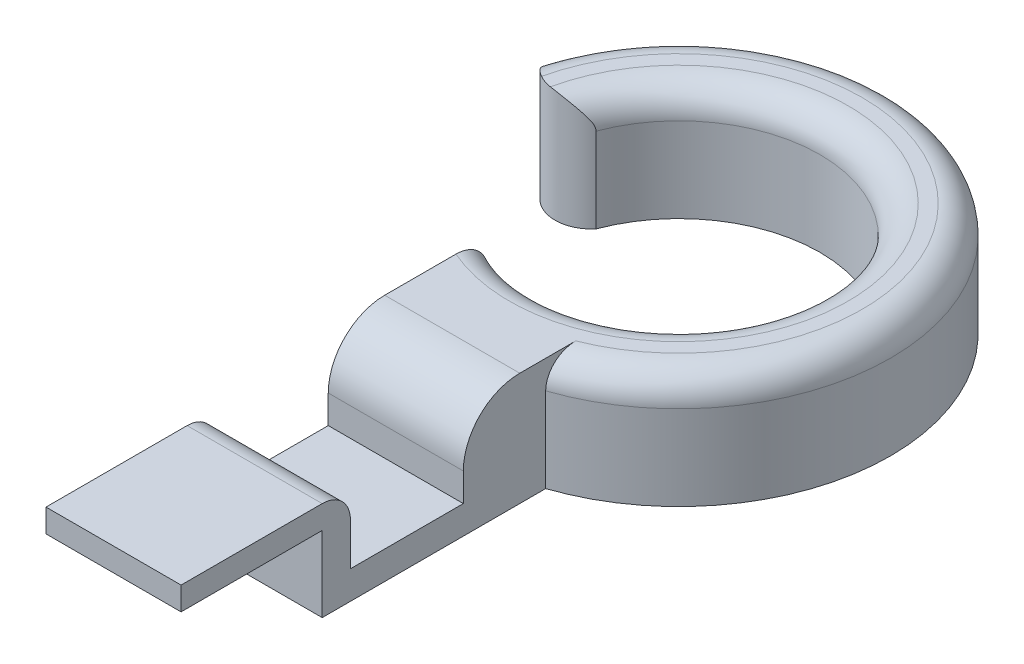
ISO-10303-21;
HEADER;
FILE_DESCRIPTION(('STEP AP214'),'2;1');
FILE_NAME('part.step','',(''),(''),'','','');
FILE_SCHEMA(('AUTOMOTIVE_DESIGN { 1 0 10303 214 1 1 1 1 }'));
ENDSEC;
DATA;
#1=APPLICATION_CONTEXT('core data for automotive mechanical design processes');
#2=APPLICATION_PROTOCOL_DEFINITION('international standard','automotive_design',2000,#1);
#3=PRODUCT_CONTEXT('',#1,'mechanical');
#4=PRODUCT('Part','Part','',(#3));
#5=PRODUCT_RELATED_PRODUCT_CATEGORY('part','',(#4));
#6=PRODUCT_DEFINITION_FORMATION('','',#4);
#7=PRODUCT_DEFINITION_CONTEXT('part definition',#1,'design');
#8=PRODUCT_DEFINITION('design','',#6,#7);
#9=PRODUCT_DEFINITION_SHAPE('','',#8);
#10=(LENGTH_UNIT() NAMED_UNIT(*) SI_UNIT(.MILLI.,.METRE.));
#11=(NAMED_UNIT(*) PLANE_ANGLE_UNIT() SI_UNIT($,.RADIAN.));
#12=(NAMED_UNIT(*) SI_UNIT($,.STERADIAN.) SOLID_ANGLE_UNIT());
#13=UNCERTAINTY_MEASURE_WITH_UNIT(LENGTH_MEASURE(1.E-05),#10,'distance_accuracy_value','');
#14=(GEOMETRIC_REPRESENTATION_CONTEXT(3) GLOBAL_UNCERTAINTY_ASSIGNED_CONTEXT((#13)) GLOBAL_UNIT_ASSIGNED_CONTEXT((#10,
#11,#12)) REPRESENTATION_CONTEXT('',''));
#15=CARTESIAN_POINT('',(0.,0.,0.));
#16=DIRECTION('',(0.,0.,1.));
#17=DIRECTION('',(1.,0.,0.));
#18=AXIS2_PLACEMENT_3D('',#15,#16,#17);
#19=CARTESIAN_POINT('',(0.,2.,0.));
#20=DIRECTION('',(0.,-1.,0.));
#21=DIRECTION('',(0.,0.,-1.));
#22=AXIS2_PLACEMENT_3D('',#19,#20,#21);
#23=PLANE('',#22);
#24=DIRECTION('',(-1.,0.,0.));
#25=VECTOR('',#24,1.);
#26=CARTESIAN_POINT('',(4.78599106831754,2.,28.0520656339008));
#27=LINE('',#26,#25);
#28=CARTESIAN_POINT('',(4.78599106831754,2.,28.0520656339008));
#29=VERTEX_POINT('',#28);
#30=CARTESIAN_POINT('',(-4.78599106831754,2.,28.0520656339008));
#31=VERTEX_POINT('',#30);
#32=EDGE_CURVE('E212',#29,#31,#27,.T.);
#33=ORIENTED_EDGE('',*,*,#32,.F.);
#34=DIRECTION('',(0.,0.,1.));
#35=VECTOR('',#34,1.);
#36=CARTESIAN_POINT('',(4.78599106831754,2.,20.0520656339008));
#37=LINE('',#36,#35);
#38=CARTESIAN_POINT('',(4.78599106831754,2.,20.0520656339008));
#39=VERTEX_POINT('',#38);
#40=EDGE_CURVE('E223',#39,#29,#37,.T.);
#41=ORIENTED_EDGE('',*,*,#40,.F.);
#42=DIRECTION('',(1.,0.,0.));
#43=VECTOR('',#42,1.);
#44=CARTESIAN_POINT('',(4.78599106831754,2.,20.0520656339008));
#45=LINE('',#44,#43);
#46=CARTESIAN_POINT('',(-4.78599106831753,2.,20.0520656339008));
#47=VERTEX_POINT('',#46);
#48=EDGE_CURVE('E229',#47,#39,#45,.T.);
#49=ORIENTED_EDGE('',*,*,#48,.F.);
#50=DIRECTION('',(0.,0.,-1.));
#51=VECTOR('',#50,1.);
#52=CARTESIAN_POINT('',(-4.78599106831753,2.,20.0520656339008));
#53=LINE('',#52,#51);
#54=EDGE_CURVE('E226',#31,#47,#53,.T.);
#55=ORIENTED_EDGE('',*,*,#54,.F.);
#56=EDGE_LOOP('',(#33,#41,#49,#55));
#57=FACE_BOUND('',#56,.T.);
#58=ADVANCED_FACE('F59',(#57),#23,.F.);
#59=CARTESIAN_POINT('',(4.78599106831753,8.,14.2159871093774));
#60=DIRECTION('',(-1.,0.,0.));
#61=DIRECTION('',(0.,0.,1.));
#62=AXIS2_PLACEMENT_3D('',#59,#60,#61);
#63=PLANE('',#62);
#64=DIRECTION('',(0.,0.,-1.));
#65=VECTOR('',#64,1.);
#66=CARTESIAN_POINT('',(4.78599106831753,8.,14.2159871093774));
#67=LINE('',#66,#65);
#68=CARTESIAN_POINT('',(4.78599106831753,8.,16.0520656339008));
#69=VERTEX_POINT('',#68);
#70=CARTESIAN_POINT('',(4.78599106831753,8.,12.0869470708688));
#71=VERTEX_POINT('',#70);
#72=EDGE_CURVE('E241',#69,#71,#67,.T.);
#73=ORIENTED_EDGE('',*,*,#72,.F.);
#74=CARTESIAN_POINT('',(4.78599106831753,4.,16.0520656339008));
#75=DIRECTION('',(-1.,0.,0.));
#76=DIRECTION('',(0.,0.,1.));
#77=AXIS2_PLACEMENT_3D('',#74,#75,#76);
#78=CIRCLE('',#77,4.);
#79=CARTESIAN_POINT('',(4.78599106831754,4.,20.0520656339008));
#80=VERTEX_POINT('',#79);
#81=EDGE_CURVE('E283',#69,#80,#78,.F.);
#82=ORIENTED_EDGE('',*,*,#81,.T.);
#83=DIRECTION('',(0.,-1.,0.));
#84=VECTOR('',#83,1.);
#85=CARTESIAN_POINT('',(4.78599106831754,8.,20.0520656339008));
#86=LINE('',#85,#84);
#87=EDGE_CURVE('E249',#80,#39,#86,.T.);
#88=ORIENTED_EDGE('',*,*,#87,.T.);
#89=ORIENTED_EDGE('',*,*,#40,.T.);
#90=DIRECTION('',(0.,1.,0.));
#91=VECTOR('',#90,1.);
#92=CARTESIAN_POINT('',(4.78599106831754,0.,28.0520656339008));
#93=LINE('',#92,#91);
#94=CARTESIAN_POINT('',(4.78599106831754,5.,28.0520656339008));
#95=VERTEX_POINT('',#94);
#96=EDGE_CURVE('E210',#29,#95,#93,.T.);
#97=ORIENTED_EDGE('',*,*,#96,.T.);
#98=CARTESIAN_POINT('',(4.78599106831754,5.,30.0520656339008));
#99=DIRECTION('',(-1.,0.,0.));
#100=DIRECTION('',(0.,0.,1.));
#101=AXIS2_PLACEMENT_3D('',#98,#99,#100);
#102=CIRCLE('',#101,2.);
#103=CARTESIAN_POINT('',(4.78599106831754,7.,30.0520656339008));
#104=VERTEX_POINT('',#103);
#105=EDGE_CURVE('E278',#95,#104,#102,.F.);
#106=ORIENTED_EDGE('',*,*,#105,.T.);
#107=DIRECTION('',(0.,0.,1.));
#108=VECTOR('',#107,1.);
#109=CARTESIAN_POINT('',(4.78599106831754,7.,0.));
#110=LINE('',#109,#108);
#111=CARTESIAN_POINT('',(4.78599106831754,7.,40.0520656339008));
#112=VERTEX_POINT('',#111);
#113=EDGE_CURVE('E208',#104,#112,#110,.T.);
#114=ORIENTED_EDGE('',*,*,#113,.T.);
#115=DIRECTION('',(0.,1.,0.));
#116=VECTOR('',#115,1.);
#117=CARTESIAN_POINT('',(4.78599106831754,5.35205161908081,40.0520656339008));
#118=LINE('',#117,#116);
#119=CARTESIAN_POINT('',(4.78599106831754,5.35205161908081,40.0520656339008));
#120=VERTEX_POINT('',#119);
#121=EDGE_CURVE('E203',#120,#112,#118,.T.);
#122=ORIENTED_EDGE('',*,*,#121,.F.);
#123=DIRECTION('',(0.,0.,1.));
#124=VECTOR('',#123,1.);
#125=CARTESIAN_POINT('',(4.78599106831754,5.35205161908081,28.0520656339008));
#126=LINE('',#125,#124);
#127=CARTESIAN_POINT('',(4.78599106831754,5.35205161908081,30.0520656339008));
#128=VERTEX_POINT('',#127);
#129=EDGE_CURVE('E188',#128,#120,#126,.T.);
#130=ORIENTED_EDGE('',*,*,#129,.F.);
#131=DIRECTION('',(0.,-1.,0.));
#132=VECTOR('',#131,1.);
#133=CARTESIAN_POINT('',(4.78599106831754,2.,30.0520656339008));
#134=LINE('',#133,#132);
#135=CARTESIAN_POINT('',(4.78599106831754,0.,30.0520656339008));
#136=VERTEX_POINT('',#135);
#137=EDGE_CURVE('E232',#128,#136,#134,.T.);
#138=ORIENTED_EDGE('',*,*,#137,.T.);
#139=DIRECTION('',(0.,0.,-1.));
#140=VECTOR('',#139,1.);
#141=CARTESIAN_POINT('',(4.78599106831753,0.,14.2159871093774));
#142=LINE('',#141,#140);
#143=CARTESIAN_POINT('',(4.78599106831753,0.,14.2159871093774));
#144=VERTEX_POINT('',#143);
#145=EDGE_CURVE('E238',#136,#144,#142,.T.);
#146=ORIENTED_EDGE('',*,*,#145,.T.);
#147=DIRECTION('',(0.,-1.,0.));
#148=VECTOR('',#147,1.);
#149=CARTESIAN_POINT('',(4.78599106831753,8.,14.2159871093774));
#150=LINE('',#149,#148);
#151=CARTESIAN_POINT('',(4.78599106831753,6.,14.2159871093774));
#152=VERTEX_POINT('',#151);
#153=EDGE_CURVE('E271',#152,#144,#150,.T.);
#154=ORIENTED_EDGE('',*,*,#153,.F.);
#155=CARTESIAN_POINT('',(4.78599106831753,6.,14.2159871093774));
#156=CARTESIAN_POINT('',(4.78599106831753,6.05405639016702,14.2159880628272));
#157=CARTESIAN_POINT('',(4.78599106831753,6.1080861928889,14.2136731071381));
#158=CARTESIAN_POINT('',(4.78599106831753,6.21574434124351,14.2044468308801));
#159=CARTESIAN_POINT('',(4.78599106831753,6.26937274227402,14.1975361568557));
#160=CARTESIAN_POINT('',(4.78599106831753,6.42884196017063,14.1700170062652));
#161=CARTESIAN_POINT('',(4.78599106831753,6.53358992422204,14.142620912641));
#162=CARTESIAN_POINT('',(4.78599106831753,6.73695380843466,14.070693816877));
#163=CARTESIAN_POINT('',(4.78599106831753,6.8355695447363,14.0261623012616));
#164=CARTESIAN_POINT('',(4.78599106831753,7.02414778347863,13.9214843008947));
#165=CARTESIAN_POINT('',(4.78599106831753,7.11410859562101,13.8613347744108));
#166=CARTESIAN_POINT('',(4.78599106831753,7.28486044688612,13.7260235836928));
#167=CARTESIAN_POINT('',(4.78599106831753,7.36543228609775,13.650585914135));
#168=CARTESIAN_POINT('',(4.78599106831753,7.51349472929332,13.4878261177695));
#169=CARTESIAN_POINT('',(4.78599106831753,7.58098289043209,13.4005017767796));
#170=CARTESIAN_POINT('',(4.78599106831753,7.70458284873403,13.2118723527539));
#171=CARTESIAN_POINT('',(4.78599106831753,7.75996223912073,13.1100880380192));
#172=CARTESIAN_POINT('',(4.78599106831753,7.85394179219382,12.8990199352899));
#173=CARTESIAN_POINT('',(4.78599106831753,7.89253533619117,12.7897332087107));
#174=CARTESIAN_POINT('',(4.78599106831753,7.94833447803894,12.5818043664288));
#175=CARTESIAN_POINT('',(4.78599106831753,7.96773868452351,12.4837424086438));
#176=CARTESIAN_POINT('',(4.78599106831753,7.99357143827219,12.2860989760579));
#177=CARTESIAN_POINT('',(4.78599106831753,8.00002315660658,12.1865205363803));
#178=CARTESIAN_POINT('',(4.78599106831753,8.,12.0869470708688));
#179=B_SPLINE_CURVE_WITH_KNOTS('',3,(#155,#156,#157,#158,#159,#160,#161,#162,#163,#164,#165,
#166,#167,#168,#169,#170,#171,#172,#173,#174,#175,#176,#177,#178),.UNSPECIFIED.,.F.,.F.,(4,2,2,
2,2,2,2,2,2,2,2,4),(0.,0.162067175844664,0.324111556240544,0.647243548458102,0.970385224316631,
1.29358988186395,1.62325407891284,1.95297976819921,2.29909828730773,2.64535315811132,
2.94440040987108,3.24291220918006),.UNSPECIFIED.);
#180=EDGE_CURVE('E12',#152,#71,#179,.T.);
#181=ORIENTED_EDGE('',*,*,#180,.T.);
#182=EDGE_LOOP('',(#73,#82,#88,#89,#97,#106,#114,#122,#130,#138,#146,#154,#181));
#183=FACE_BOUND('',#182,.T.);
#184=ADVANCED_FACE('F318',(#183),#63,.F.);
#185=CARTESIAN_POINT('',(0.,8.,0.));
#186=DIRECTION('',(0.,-1.,0.));
#187=DIRECTION('',(0.,0.,-1.));
#188=AXIS2_PLACEMENT_3D('',#185,#186,#187);
#189=CYLINDRICAL_SURFACE('',#188,15.);
#190=DIRECTION('',(0.,-1.,0.));
#191=VECTOR('',#190,1.);
#192=CARTESIAN_POINT('',(-13.8910300067238,8.,-5.66032555179457));
#193=LINE('',#192,#191);
#194=CARTESIAN_POINT('',(-13.8910300067238,6.,-5.66032555179457));
#195=VERTEX_POINT('',#194);
#196=CARTESIAN_POINT('',(-13.8910300067238,0.,-5.66032555179457));
#197=VERTEX_POINT('',#196);
#198=EDGE_CURVE('E269',#195,#197,#193,.T.);
#199=ORIENTED_EDGE('',*,*,#198,.F.);
#200=CARTESIAN_POINT('',(0.,6.,0.));
#201=DIRECTION('',(0.,1.,0.));
#202=DIRECTION('',(0.,0.,1.));
#203=AXIS2_PLACEMENT_3D('',#200,#201,#202);
#204=CIRCLE('',#203,15.);
#205=EDGE_CURVE('E87',#195,#152,#204,.F.);
#206=ORIENTED_EDGE('',*,*,#205,.T.);
#207=ORIENTED_EDGE('',*,*,#153,.T.);
#208=CARTESIAN_POINT('',(0.,0.,0.));
#209=DIRECTION('',(0.,1.,0.));
#210=DIRECTION('',(0.,0.,1.));
#211=AXIS2_PLACEMENT_3D('',#208,#209,#210);
#212=CIRCLE('',#211,15.);
#213=EDGE_CURVE('E252',#144,#197,#212,.T.);
#214=ORIENTED_EDGE('',*,*,#213,.T.);
#215=EDGE_LOOP('',(#199,#206,#207,#214));
#216=FACE_BOUND('',#215,.T.);
#217=ADVANCED_FACE('F313',(#216),#189,.T.);
#218=CARTESIAN_POINT('',(-11.3484349810838,8.,-5.17058895831853));
#219=DIRECTION('',(0.,-1.,0.));
#220=DIRECTION('',(0.,0.,-1.));
#221=AXIS2_PLACEMENT_3D('',#218,#219,#220);
#222=CYLINDRICAL_SURFACE('',#221,2.58933029862915);
#223=CARTESIAN_POINT('',(-11.3484349810838,8.,-5.17058895831853));
#224=DIRECTION('',(0.,1.,0.));
#225=DIRECTION('',(0.,0.,-1.));
#226=AXIS2_PLACEMENT_3D('',#223,#224,#225);
#227=CIRCLE('',#226,2.58933029862915);
#228=CARTESIAN_POINT('',(-12.6632146260094,8.,-2.93989716412367));
#229=VERTEX_POINT('',#228);
#230=CARTESIAN_POINT('',(-11.7133687856332,8.,-2.60710408149635));
#231=VERTEX_POINT('',#230);
#232=EDGE_CURVE('E243',#229,#231,#227,.T.);
#233=ORIENTED_EDGE('',*,*,#232,.F.);
#234=CARTESIAN_POINT('',(-12.6632146260094,8.,-2.93989716412367));
#235=CARTESIAN_POINT('',(-12.7106620577113,8.00000746396548,-2.96784776262815));
#236=CARTESIAN_POINT('',(-12.7571817496574,7.99793039344084,-2.99732035939697));
#237=CARTESIAN_POINT('',(-12.8479764030309,7.9899108952267,-3.05895552434027));
#238=CARTESIAN_POINT('',(-12.8922540510137,7.98397321765001,-3.09111474455583));
#239=CARTESIAN_POINT('',(-12.9779257267629,7.96860076121418,-3.15755409693548));
#240=CARTESIAN_POINT('',(-13.0193411722777,7.9591963159571,-3.19181374488249));
#241=CARTESIAN_POINT('',(-13.0994971334008,7.93720466159052,-3.26237841933517));
#242=CARTESIAN_POINT('',(-13.1382368627824,7.92461652201368,-3.2986840413828));
#243=CARTESIAN_POINT('',(-13.2498359141746,7.88268818410401,-3.40983061896135));
#244=CARTESIAN_POINT('',(-13.3185624890383,7.84909002625976,-3.48728356283453));
#245=CARTESIAN_POINT('',(-13.4445583291215,7.77276115208533,-3.6470064877206));
#246=CARTESIAN_POINT('',(-13.5017985578381,7.73000784193293,-3.72928801361369));
#247=CARTESIAN_POINT('',(-13.6303096952075,7.61443798530803,-3.93803242840127));
#248=CARTESIAN_POINT('',(-13.6946394023639,7.53717610049649,-4.06632515432415));
#249=CARTESIAN_POINT('',(-13.7998170221242,7.37088373834415,-4.32506049452362));
#250=CARTESIAN_POINT('',(-13.8406106435744,7.28182662944969,-4.45550737111688));
#251=CARTESIAN_POINT('',(-13.8860273775632,7.14030880099239,-4.65109676173774));
#252=CARTESIAN_POINT('',(-13.8985838246612,7.09124017199485,-4.71699001575437));
#253=CARTESIAN_POINT('',(-13.9184164137787,6.99070287472261,-4.84779139462674));
#254=CARTESIAN_POINT('',(-13.9256906411053,6.93923334335888,-4.91269915392285));
#255=CARTESIAN_POINT('',(-13.9352919596437,6.83394321348037,-5.04057894802302));
#256=CARTESIAN_POINT('',(-13.9376353505607,6.78013096331091,-5.10355668028626));
#257=CARTESIAN_POINT('',(-13.9378837839873,6.66945828121274,-5.22674122000851));
#258=CARTESIAN_POINT('',(-13.9357926758436,6.61260053467561,-5.28695038435643));
#259=CARTESIAN_POINT('',(-13.9296203002436,6.51855403318907,-5.37863549562959));
#260=CARTESIAN_POINT('',(-13.9267102509077,6.48288601315478,-5.41175003160111));
#261=CARTESIAN_POINT('',(-13.9199650095851,6.40913613318279,-5.47534998712456));
#262=CARTESIAN_POINT('',(-13.9161275848591,6.37104861373865,-5.50582881679198));
#263=CARTESIAN_POINT('',(-13.9091900938684,6.30166775143495,-5.55479335350434));
#264=CARTESIAN_POINT('',(-13.9061533249127,6.27113712023773,-5.57435015306475));
#265=CARTESIAN_POINT('',(-13.9004372396862,6.20781454972139,-5.60901600319573));
#266=CARTESIAN_POINT('',(-13.8977550755154,6.17504430115089,-5.62416183652136));
#267=CARTESIAN_POINT('',(-13.8942332141368,6.11851691271627,-5.64346321757809));
#268=CARTESIAN_POINT('',(-13.8930771340861,6.09548519463696,-5.64960468912776));
#269=CARTESIAN_POINT('',(-13.8914574177994,6.0483560251703,-5.65811049867585));
#270=CARTESIAN_POINT('',(-13.8910049732065,6.02424750231507,-5.66041382949189));
#271=CARTESIAN_POINT('',(-13.8910300067238,6.,-5.66032555179456));
#272=B_SPLINE_CURVE_WITH_KNOTS('',3,(#234,#235,#236,#237,#238,#239,#240,#241,#242,#243,#244,
#245,#246,#247,#248,#249,#250,#251,#252,#253,#254,#255,#256,#257,#258,#259,#260,#261,#262,#263,
#264,#265,#266,#267,#268,#269,#270,#271),.UNSPECIFIED.,.F.,.F.,(4,2,2,2,2,2,2,2,2,2,2,2,2,2,2,2,
2,2,4),(0.,0.165096913286102,0.329991073826881,0.493475420132112,0.657007601741218,
0.982214928950209,1.30823427376998,1.79456643548197,2.28201598963461,2.53117705351784,
2.78042838799245,3.02885447760742,3.27706501036734,3.42325896881587,3.56980847167038,
3.67877315197725,3.78680130492123,3.85808655590816,3.93049443936758),.UNSPECIFIED.);
#273=EDGE_CURVE('E302',#229,#195,#272,.T.);
#274=ORIENTED_EDGE('',*,*,#273,.T.);
#275=ORIENTED_EDGE('',*,*,#198,.T.);
#276=CARTESIAN_POINT('',(-11.3484349810838,0.,-5.17058895831853));
#277=DIRECTION('',(0.,1.,0.));
#278=DIRECTION('',(0.,0.,-1.));
#279=AXIS2_PLACEMENT_3D('',#276,#277,#278);
#280=CIRCLE('',#279,2.58933029862915);
#281=CARTESIAN_POINT('',(-9.3654080885971,0.,-3.50558573337465));
#282=VERTEX_POINT('',#281);
#283=EDGE_CURVE('E255',#197,#282,#280,.T.);
#284=ORIENTED_EDGE('',*,*,#283,.T.);
#285=DIRECTION('',(0.,-1.,0.));
#286=VECTOR('',#285,1.);
#287=CARTESIAN_POINT('',(-9.3654080885971,8.,-3.50558573337465));
#288=LINE('',#287,#286);
#289=CARTESIAN_POINT('',(-9.3654080885971,6.,-3.50558573337465));
#290=VERTEX_POINT('',#289);
#291=EDGE_CURVE('E267',#290,#282,#288,.T.);
#292=ORIENTED_EDGE('',*,*,#291,.F.);
#293=CARTESIAN_POINT('',(-9.3654080885971,6.,-3.50558573337465));
#294=CARTESIAN_POINT('',(-9.36538925216868,6.02611958063902,-3.50561552467861));
#295=CARTESIAN_POINT('',(-9.36639395858563,6.05220192438168,-3.50441141289762));
#296=CARTESIAN_POINT('',(-9.37028313209126,6.10392643087464,-3.49979213296147));
#297=CARTESIAN_POINT('',(-9.37315998240813,6.12956994699653,-3.49638592435013));
#298=CARTESIAN_POINT('',(-9.38419635445596,6.20448454763751,-3.48342569408231));
#299=CARTESIAN_POINT('',(-9.39477698020875,6.25292199605602,-3.47110720628362));
#300=CARTESIAN_POINT('',(-9.41809858801442,6.33727696211903,-3.4447050622));
#301=CARTESIAN_POINT('',(-9.42996871495158,6.37374406566037,-3.43148347530372));
#302=CARTESIAN_POINT('',(-9.45610573595808,6.44503422226976,-3.40307738825022));
#303=CARTESIAN_POINT('',(-9.47037417575966,6.4798561963768,-3.38789162362866));
#304=CARTESIAN_POINT('',(-9.51647469645683,6.58310567564291,-3.34014978717726));
#305=CARTESIAN_POINT('',(-9.55129925615816,6.64933109197364,-3.30576661940159));
#306=CARTESIAN_POINT('',(-9.62946912527276,6.7818549906137,-3.23336300694196));
#307=CARTESIAN_POINT('',(-9.67323426108976,6.84784878430608,-3.19525461805361));
#308=CARTESIAN_POINT('',(-9.76677327693348,6.97587562705195,-3.11958839680077));
#309=CARTESIAN_POINT('',(-9.81655252747311,7.03790505929229,-3.08203109060582));
#310=CARTESIAN_POINT('',(-9.92156227849389,7.15785030282332,-3.00893582545884));
#311=CARTESIAN_POINT('',(-9.97676711768918,7.21578344317971,-2.97338950505124));
#312=CARTESIAN_POINT('',(-10.0927079359379,7.32755074386561,-2.90512983443694));
#313=CARTESIAN_POINT('',(-10.1534401380991,7.38138765767854,-2.87241457911977));
#314=CARTESIAN_POINT('',(-10.30826447551,7.50700714790262,-2.79719873051246));
#315=CARTESIAN_POINT('',(-10.4053437206884,7.57636081962717,-2.75666306800453));
#316=CARTESIAN_POINT('',(-10.610728516213,7.70287203535562,-2.68620445988505));
#317=CARTESIAN_POINT('',(-10.7190215956277,7.76004291595105,-2.65626988516597));
#318=CARTESIAN_POINT('',(-10.9223964583187,7.84853749866477,-2.61488899293717));
#319=CARTESIAN_POINT('',(-11.0156970972314,7.8827522564344,-2.60092305320075));
#320=CARTESIAN_POINT('',(-11.2067719689997,7.93898380323419,-2.58336921313079));
#321=CARTESIAN_POINT('',(-11.3045351435655,7.96102914226858,-2.57975693836658));
#322=CARTESIAN_POINT('',(-11.4546528966188,7.98398212185687,-2.58292305812211));
#323=CARTESIAN_POINT('',(-11.5063764498076,7.98995657375047,-2.58556020220371));
#324=CARTESIAN_POINT('',(-11.6099190517291,7.9979710447613,-2.59396993339366));
#325=CARTESIAN_POINT('',(-11.6617381445291,8.00000748227024,-2.59974536865679));
#326=CARTESIAN_POINT('',(-11.7133687856332,8.,-2.60710408149635));
#327=B_SPLINE_CURVE_WITH_KNOTS('',3,(#293,#294,#295,#296,#297,#298,#299,#300,#301,#302,#303,
#304,#305,#306,#307,#308,#309,#310,#311,#312,#313,#314,#315,#316,#317,#318,#319,#320,#321,#322,
#323,#324,#325,#326),.UNSPECIFIED.,.F.,.F.,(4,2,2,2,2,2,2,2,2,2,2,2,2,2,2,2,4),(0.,
0.0782494688612075,0.156182555364573,0.308573807791237,0.430117390212656,0.551739610966066,
0.798226859239455,1.06156963125637,1.32514932707574,1.58753743604502,1.84974758022764,
2.22645321606425,2.6027443265341,2.90264359503485,3.20183626331219,3.35802098148363,
3.51434768234412),.UNSPECIFIED.);
#328=EDGE_CURVE('E296',#290,#231,#327,.T.);
#329=ORIENTED_EDGE('',*,*,#328,.T.);
#330=EDGE_LOOP('',(#233,#274,#275,#284,#292,#329));
#331=FACE_BOUND('',#330,.T.);
#332=ADVANCED_FACE('F307',(#331),#222,.T.);
#333=CARTESIAN_POINT('',(0.,8.,0.));
#334=DIRECTION('',(0.,-1.,0.));
#335=DIRECTION('',(0.,0.,-1.));
#336=AXIS2_PLACEMENT_3D('',#333,#334,#335);
#337=CYLINDRICAL_SURFACE('',#336,10.);
#338=DIRECTION('',(0.,-1.,0.));
#339=VECTOR('',#338,1.);
#340=CARTESIAN_POINT('',(-4.78599106831753,8.,8.78033538619025));
#341=LINE('',#340,#339);
#342=CARTESIAN_POINT('',(-4.78599106831753,6.,8.78033538619025));
#343=VERTEX_POINT('',#342);
#344=CARTESIAN_POINT('',(-4.78599106831753,0.,8.78033538619025));
#345=VERTEX_POINT('',#344);
#346=EDGE_CURVE('E265',#343,#345,#341,.T.);
#347=ORIENTED_EDGE('',*,*,#346,.F.);
#348=CARTESIAN_POINT('',(0.,6.,0.));
#349=DIRECTION('',(0.,1.,0.));
#350=DIRECTION('',(0.,0.,1.));
#351=AXIS2_PLACEMENT_3D('',#348,#349,#350);
#352=CIRCLE('',#351,10.);
#353=EDGE_CURVE('E72',#343,#290,#352,.T.);
#354=ORIENTED_EDGE('',*,*,#353,.T.);
#355=ORIENTED_EDGE('',*,*,#291,.T.);
#356=CARTESIAN_POINT('',(0.,0.,0.));
#357=DIRECTION('',(0.,-1.,0.));
#358=DIRECTION('',(0.,0.,1.));
#359=AXIS2_PLACEMENT_3D('',#356,#357,#358);
#360=CIRCLE('',#359,10.);
#361=EDGE_CURVE('E258',#282,#345,#360,.T.);
#362=ORIENTED_EDGE('',*,*,#361,.T.);
#363=EDGE_LOOP('',(#347,#354,#355,#362));
#364=FACE_BOUND('',#363,.T.);
#365=ADVANCED_FACE('F312',(#364),#337,.F.);
#366=CARTESIAN_POINT('',(-4.78599106831753,8.,8.78033538619025));
#367=DIRECTION('',(1.,0.,0.));
#368=DIRECTION('',(0.,0.,-1.));
#369=AXIS2_PLACEMENT_3D('',#366,#367,#368);
#370=PLANE('',#369);
#371=DIRECTION('',(0.,0.,1.));
#372=VECTOR('',#371,1.);
#373=CARTESIAN_POINT('',(-4.78599106831753,8.,8.78033538619025));
#374=LINE('',#373,#372);
#375=CARTESIAN_POINT('',(-4.78599106831753,8.,11.004285051469));
#376=VERTEX_POINT('',#375);
#377=CARTESIAN_POINT('',(-4.78599106831753,8.,16.0520656339008));
#378=VERTEX_POINT('',#377);
#379=EDGE_CURVE('E247',#376,#378,#374,.T.);
#380=ORIENTED_EDGE('',*,*,#379,.F.);
#381=CARTESIAN_POINT('',(-4.78599106831753,8.,11.004285051469));
#382=CARTESIAN_POINT('',(-4.78599106831753,8.0000414361159,10.870019081184));
#383=CARTESIAN_POINT('',(-4.78599106831753,7.98863110600838,10.7357816299358));
#384=CARTESIAN_POINT('',(-4.78599106831753,7.94360766627205,10.4709109128445));
#385=CARTESIAN_POINT('',(-4.78599106831753,7.90996738378713,10.3402822620741));
#386=CARTESIAN_POINT('',(-4.78599106831753,7.82116213061739,10.0864487392412));
#387=CARTESIAN_POINT('',(-4.78599106831753,7.7659845166674,9.96324827695301));
#388=CARTESIAN_POINT('',(-4.78599106831753,7.635148706312,9.72824727307077));
#389=CARTESIAN_POINT('',(-4.78599106831753,7.5594990160985,9.61644202324293));
#390=CARTESIAN_POINT('',(-4.78599106831753,7.3916975290501,9.41152633051238));
#391=CARTESIAN_POINT('',(-4.78599106831753,7.30011538330391,9.31795197822577));
#392=CARTESIAN_POINT('',(-4.78599106831753,7.10097195426587,9.14961677113999));
#393=CARTESIAN_POINT('',(-4.78599106831753,6.99341725804306,9.07484819492945));
#394=CARTESIAN_POINT('',(-4.78599106831753,6.77699517310106,8.95490564077311));
#395=CARTESIAN_POINT('',(-4.78599106831753,6.6693861707443,8.90748752632424));
#396=CARTESIAN_POINT('',(-4.78599106831753,6.50291034456819,8.85247459362105));
#397=CARTESIAN_POINT('',(-4.78599106831753,6.44660856606224,8.83682703857862));
#398=CARTESIAN_POINT('',(-4.78599106831753,6.33275769294706,8.8111042360593));
#399=CARTESIAN_POINT('',(-4.78599106831753,6.27520945547055,8.80102527829064));
#400=CARTESIAN_POINT('',(-4.78599106831753,6.1812565983949,8.78933138397349));
#401=CARTESIAN_POINT('',(-4.78599106831753,6.14506078914715,8.78595799716937));
#402=CARTESIAN_POINT('',(-4.78599106831753,6.07257883670006,8.78146081362429));
#403=CARTESIAN_POINT('',(-4.78599106831753,6.03629288142626,8.78033398599133));
#404=CARTESIAN_POINT('',(-4.78599106831753,6.,8.78033538619027));
#405=B_SPLINE_CURVE_WITH_KNOTS('',3,(#381,#382,#383,#384,#385,#386,#387,#388,#389,#390,#391,
#392,#393,#394,#395,#396,#397,#398,#399,#400,#401,#402,#403,#404),.UNSPECIFIED.,.F.,.F.,(4,2,2,
2,2,2,2,2,2,2,2,4),(0.,0.40228582998395,0.805064307245485,1.20807958787091,1.61092767120267,
2.00156594182911,2.3920435585799,2.74260032632707,2.91767714011277,3.09263716113711,
3.2016319003665,3.31047949215309),.UNSPECIFIED.);
#406=EDGE_CURVE('E79',#376,#343,#405,.T.);
#407=ORIENTED_EDGE('',*,*,#406,.T.);
#408=ORIENTED_EDGE('',*,*,#346,.T.);
#409=DIRECTION('',(0.,0.,1.));
#410=VECTOR('',#409,1.);
#411=CARTESIAN_POINT('',(-4.78599106831753,0.,8.78033538619025));
#412=LINE('',#411,#410);
#413=CARTESIAN_POINT('',(-4.78599106831753,0.,30.0520656339008));
#414=VERTEX_POINT('',#413);
#415=EDGE_CURVE('E244',#345,#414,#412,.T.);
#416=ORIENTED_EDGE('',*,*,#415,.T.);
#417=DIRECTION('',(0.,-1.,0.));
#418=VECTOR('',#417,1.);
#419=CARTESIAN_POINT('',(-4.78599106831753,2.,30.0520656339008));
#420=LINE('',#419,#418);
#421=CARTESIAN_POINT('',(-4.78599106831754,5.35205161908081,30.0520656339008));
#422=VERTEX_POINT('',#421);
#423=EDGE_CURVE('E235',#422,#414,#420,.T.);
#424=ORIENTED_EDGE('',*,*,#423,.F.);
#425=DIRECTION('',(0.,0.,1.));
#426=VECTOR('',#425,1.);
#427=CARTESIAN_POINT('',(-4.78599106831754,5.35205161908081,28.0520656339008));
#428=LINE('',#427,#426);
#429=CARTESIAN_POINT('',(-4.78599106831754,5.35205161908081,40.0520656339008));
#430=VERTEX_POINT('',#429);
#431=EDGE_CURVE('E194',#422,#430,#428,.T.);
#432=ORIENTED_EDGE('',*,*,#431,.T.);
#433=DIRECTION('',(0.,-1.,0.));
#434=VECTOR('',#433,1.);
#435=CARTESIAN_POINT('',(-4.78599106831754,7.,40.0520656339008));
#436=LINE('',#435,#434);
#437=CARTESIAN_POINT('',(-4.78599106831754,7.,40.0520656339008));
#438=VERTEX_POINT('',#437);
#439=EDGE_CURVE('E191',#438,#430,#436,.T.);
#440=ORIENTED_EDGE('',*,*,#439,.F.);
#441=DIRECTION('',(0.,0.,1.));
#442=VECTOR('',#441,1.);
#443=CARTESIAN_POINT('',(-4.78599106831753,7.,0.));
#444=LINE('',#443,#442);
#445=CARTESIAN_POINT('',(-4.78599106831754,7.,30.0520656339008));
#446=VERTEX_POINT('',#445);
#447=EDGE_CURVE('E179',#446,#438,#444,.T.);
#448=ORIENTED_EDGE('',*,*,#447,.F.);
#449=CARTESIAN_POINT('',(-4.78599106831754,5.,30.0520656339008));
#450=DIRECTION('',(1.,0.,0.));
#451=DIRECTION('',(0.,0.,-1.));
#452=AXIS2_PLACEMENT_3D('',#449,#450,#451);
#453=CIRCLE('',#452,2.);
#454=CARTESIAN_POINT('',(-4.78599106831754,5.,28.0520656339008));
#455=VERTEX_POINT('',#454);
#456=EDGE_CURVE('E274',#446,#455,#453,.F.);
#457=ORIENTED_EDGE('',*,*,#456,.T.);
#458=DIRECTION('',(0.,1.,0.));
#459=VECTOR('',#458,1.);
#460=CARTESIAN_POINT('',(-4.78599106831754,0.,28.0520656339008));
#461=LINE('',#460,#459);
#462=EDGE_CURVE('E187',#31,#455,#461,.T.);
#463=ORIENTED_EDGE('',*,*,#462,.F.);
#464=ORIENTED_EDGE('',*,*,#54,.T.);
#465=DIRECTION('',(0.,-1.,0.));
#466=VECTOR('',#465,1.);
#467=CARTESIAN_POINT('',(-4.78599106831754,8.,20.0520656339008));
#468=LINE('',#467,#466);
#469=CARTESIAN_POINT('',(-4.78599106831754,4.,20.0520656339008));
#470=VERTEX_POINT('',#469);
#471=EDGE_CURVE('E263',#470,#47,#468,.T.);
#472=ORIENTED_EDGE('',*,*,#471,.F.);
#473=CARTESIAN_POINT('',(-4.78599106831753,4.,16.0520656339008));
#474=DIRECTION('',(1.,0.,0.));
#475=DIRECTION('',(0.,0.,-1.));
#476=AXIS2_PLACEMENT_3D('',#473,#474,#475);
#477=CIRCLE('',#476,4.);
#478=EDGE_CURVE('E287',#470,#378,#477,.F.);
#479=ORIENTED_EDGE('',*,*,#478,.T.);
#480=EDGE_LOOP('',(#380,#407,#408,#416,#424,#432,#440,#448,#457,#463,#464,#472,#479));
#481=FACE_BOUND('',#480,.T.);
#482=ADVANCED_FACE('F192',(#481),#370,.F.);
#483=CARTESIAN_POINT('',(-4.78599106831754,8.,20.0520656339008));
#484=DIRECTION('',(0.,0.,-1.));
#485=DIRECTION('',(-1.,0.,0.));
#486=AXIS2_PLACEMENT_3D('',#483,#484,#485);
#487=PLANE('',#486);
#488=ORIENTED_EDGE('',*,*,#87,.F.);
#489=DIRECTION('',(1.,0.,0.));
#490=VECTOR('',#489,1.);
#491=CARTESIAN_POINT('',(-4.78599106831754,4.,20.0520656339008));
#492=LINE('',#491,#490);
#493=EDGE_CURVE('E285',#80,#470,#492,.F.);
#494=ORIENTED_EDGE('',*,*,#493,.T.);
#495=ORIENTED_EDGE('',*,*,#471,.T.);
#496=ORIENTED_EDGE('',*,*,#48,.T.);
#497=EDGE_LOOP('',(#488,#494,#495,#496));
#498=FACE_BOUND('',#497,.T.);
#499=ADVANCED_FACE('F359',(#498),#487,.F.);
#500=CARTESIAN_POINT('',(0.,8.,0.));
#501=DIRECTION('',(0.,1.,0.));
#502=DIRECTION('',(0.,0.,1.));
#503=AXIS2_PLACEMENT_3D('',#500,#501,#502);
#504=PLANE('',#503);
#505=ORIENTED_EDGE('',*,*,#72,.T.);
#506=CARTESIAN_POINT('',(0.,8.,0.));
#507=DIRECTION('',(0.,1.,0.));
#508=DIRECTION('',(0.,0.,1.));
#509=AXIS2_PLACEMENT_3D('',#506,#507,#508);
#510=CIRCLE('',#509,13.);
#511=EDGE_CURVE('E293',#71,#229,#510,.T.);
#512=ORIENTED_EDGE('',*,*,#511,.T.);
#513=ORIENTED_EDGE('',*,*,#232,.T.);
#514=CARTESIAN_POINT('',(0.,8.,0.));
#515=DIRECTION('',(0.,1.,0.));
#516=DIRECTION('',(0.,0.,1.));
#517=AXIS2_PLACEMENT_3D('',#514,#515,#516);
#518=CIRCLE('',#517,12.);
#519=EDGE_CURVE('E290',#231,#376,#518,.F.);
#520=ORIENTED_EDGE('',*,*,#519,.T.);
#521=ORIENTED_EDGE('',*,*,#379,.T.);
#522=DIRECTION('',(1.,0.,0.));
#523=VECTOR('',#522,1.);
#524=CARTESIAN_POINT('',(4.78599106831754,8.,16.0520656339008));
#525=LINE('',#524,#523);
#526=EDGE_CURVE('E280',#378,#69,#525,.T.);
#527=ORIENTED_EDGE('',*,*,#526,.T.);
#528=EDGE_LOOP('',(#505,#512,#513,#520,#521,#527));
#529=FACE_BOUND('',#528,.T.);
#530=ADVANCED_FACE('F356',(#529),#504,.T.);
#531=CARTESIAN_POINT('',(0.,0.,0.));
#532=DIRECTION('',(0.,1.,0.));
#533=DIRECTION('',(0.,0.,1.));
#534=AXIS2_PLACEMENT_3D('',#531,#532,#533);
#535=PLANE('',#534);
#536=ORIENTED_EDGE('',*,*,#145,.F.);
#537=DIRECTION('',(-1.,0.,0.));
#538=VECTOR('',#537,1.);
#539=CARTESIAN_POINT('',(4.78599106831754,0.,30.0520656339008));
#540=LINE('',#539,#538);
#541=EDGE_CURVE('E222',#136,#414,#540,.T.);
#542=ORIENTED_EDGE('',*,*,#541,.T.);
#543=ORIENTED_EDGE('',*,*,#415,.F.);
#544=ORIENTED_EDGE('',*,*,#361,.F.);
#545=ORIENTED_EDGE('',*,*,#283,.F.);
#546=ORIENTED_EDGE('',*,*,#213,.F.);
#547=EDGE_LOOP('',(#536,#542,#543,#544,#545,#546));
#548=FACE_BOUND('',#547,.T.);
#549=ADVANCED_FACE('F353',(#548),#535,.F.);
#550=CARTESIAN_POINT('',(4.78599106831754,2.,30.0520656339008));
#551=DIRECTION('',(0.,0.,1.));
#552=DIRECTION('',(1.,0.,0.));
#553=AXIS2_PLACEMENT_3D('',#550,#551,#552);
#554=PLANE('',#553);
#555=ORIENTED_EDGE('',*,*,#541,.F.);
#556=ORIENTED_EDGE('',*,*,#137,.F.);
#557=DIRECTION('',(1.,0.,0.));
#558=VECTOR('',#557,1.);
#559=CARTESIAN_POINT('',(4.78599106831754,5.35205161908081,30.0520656339008));
#560=LINE('',#559,#558);
#561=EDGE_CURVE('E217',#422,#128,#560,.T.);
#562=ORIENTED_EDGE('',*,*,#561,.F.);
#563=ORIENTED_EDGE('',*,*,#423,.T.);
#564=EDGE_LOOP('',(#555,#556,#562,#563));
#565=FACE_BOUND('',#564,.T.);
#566=ADVANCED_FACE('F350',(#565),#554,.T.);
#567=CARTESIAN_POINT('',(4.78599106831754,7.,0.));
#568=DIRECTION('',(0.,-1.,0.));
#569=DIRECTION('',(0.,0.,-1.));
#570=AXIS2_PLACEMENT_3D('',#567,#568,#569);
#571=PLANE('',#570);
#572=ORIENTED_EDGE('',*,*,#113,.F.);
#573=DIRECTION('',(-1.,0.,0.));
#574=VECTOR('',#573,1.);
#575=CARTESIAN_POINT('',(4.78599106831754,7.,30.0520656339008));
#576=LINE('',#575,#574);
#577=EDGE_CURVE('E186',#104,#446,#576,.T.);
#578=ORIENTED_EDGE('',*,*,#577,.T.);
#579=ORIENTED_EDGE('',*,*,#447,.T.);
#580=DIRECTION('',(-1.,0.,0.));
#581=VECTOR('',#580,1.);
#582=CARTESIAN_POINT('',(4.78599106831754,7.,40.0520656339008));
#583=LINE('',#582,#581);
#584=EDGE_CURVE('E184',#112,#438,#583,.T.);
#585=ORIENTED_EDGE('',*,*,#584,.F.);
#586=EDGE_LOOP('',(#572,#578,#579,#585));
#587=FACE_BOUND('',#586,.T.);
#588=ADVANCED_FACE('F182',(#587),#571,.F.);
#589=CARTESIAN_POINT('',(4.78599106831754,0.,28.0520656339008));
#590=DIRECTION('',(0.,0.,1.));
#591=DIRECTION('',(1.,0.,0.));
#592=AXIS2_PLACEMENT_3D('',#589,#590,#591);
#593=PLANE('',#592);
#594=ORIENTED_EDGE('',*,*,#462,.T.);
#595=DIRECTION('',(-1.,0.,0.));
#596=VECTOR('',#595,1.);
#597=CARTESIAN_POINT('',(4.78599106831754,5.,28.0520656339008));
#598=LINE('',#597,#596);
#599=EDGE_CURVE('E276',#455,#95,#598,.F.);
#600=ORIENTED_EDGE('',*,*,#599,.T.);
#601=ORIENTED_EDGE('',*,*,#96,.F.);
#602=ORIENTED_EDGE('',*,*,#32,.T.);
#603=EDGE_LOOP('',(#594,#600,#601,#602));
#604=FACE_BOUND('',#603,.T.);
#605=ADVANCED_FACE('F355',(#604),#593,.F.);
#606=CARTESIAN_POINT('',(4.78599106831754,5.35205161908081,28.0520656339008));
#607=DIRECTION('',(0.,-1.,0.));
#608=DIRECTION('',(0.,0.,-1.));
#609=AXIS2_PLACEMENT_3D('',#606,#607,#608);
#610=PLANE('',#609);
#611=ORIENTED_EDGE('',*,*,#431,.F.);
#612=ORIENTED_EDGE('',*,*,#561,.T.);
#613=ORIENTED_EDGE('',*,*,#129,.T.);
#614=DIRECTION('',(1.,0.,0.));
#615=VECTOR('',#614,1.);
#616=CARTESIAN_POINT('',(-4.78599106831754,5.35205161908081,40.0520656339008));
#617=LINE('',#616,#615);
#618=EDGE_CURVE('E198',#430,#120,#617,.T.);
#619=ORIENTED_EDGE('',*,*,#618,.F.);
#620=EDGE_LOOP('',(#611,#612,#613,#619));
#621=FACE_BOUND('',#620,.T.);
#622=ADVANCED_FACE('F327',(#621),#610,.T.);
#623=CARTESIAN_POINT('',(4.78599106831754,5.,30.0520656339008));
#624=DIRECTION('',(-1.,0.,0.));
#625=DIRECTION('',(0.,0.,1.));
#626=AXIS2_PLACEMENT_3D('',#623,#624,#625);
#627=CYLINDRICAL_SURFACE('',#626,2.);
#628=ORIENTED_EDGE('',*,*,#105,.F.);
#629=ORIENTED_EDGE('',*,*,#599,.F.);
#630=ORIENTED_EDGE('',*,*,#456,.F.);
#631=ORIENTED_EDGE('',*,*,#577,.F.);
#632=EDGE_LOOP('',(#628,#629,#630,#631));
#633=FACE_BOUND('',#632,.T.);
#634=ADVANCED_FACE('F323',(#633),#627,.T.);
#635=CARTESIAN_POINT('',(0.,4.,16.0520656339008));
#636=DIRECTION('',(-1.,0.,0.));
#637=DIRECTION('',(0.,0.,1.));
#638=AXIS2_PLACEMENT_3D('',#635,#636,#637);
#639=CYLINDRICAL_SURFACE('',#638,4.);
#640=ORIENTED_EDGE('',*,*,#478,.F.);
#641=ORIENTED_EDGE('',*,*,#493,.F.);
#642=ORIENTED_EDGE('',*,*,#81,.F.);
#643=ORIENTED_EDGE('',*,*,#526,.F.);
#644=EDGE_LOOP('',(#640,#641,#642,#643));
#645=FACE_BOUND('',#644,.T.);
#646=ADVANCED_FACE('F326',(#645),#639,.T.);
#647=CARTESIAN_POINT('',(0.,6.,0.));
#648=DIRECTION('',(0.,1.,0.));
#649=DIRECTION('',(0.,0.,1.));
#650=AXIS2_PLACEMENT_3D('',#647,#648,#649);
#651=TOROIDAL_SURFACE('',#650,13.,2.);
#652=ORIENTED_EDGE('',*,*,#180,.F.);
#653=ORIENTED_EDGE('',*,*,#205,.F.);
#654=ORIENTED_EDGE('',*,*,#273,.F.);
#655=ORIENTED_EDGE('',*,*,#511,.F.);
#656=EDGE_LOOP('',(#652,#653,#654,#655));
#657=FACE_BOUND('',#656,.T.);
#658=ADVANCED_FACE('F330',(#657),#651,.T.);
#659=CARTESIAN_POINT('',(0.,6.,0.));
#660=DIRECTION('',(0.,1.,0.));
#661=DIRECTION('',(0.,0.,1.));
#662=AXIS2_PLACEMENT_3D('',#659,#660,#661);
#663=TOROIDAL_SURFACE('',#662,12.,2.);
#664=ORIENTED_EDGE('',*,*,#328,.F.);
#665=ORIENTED_EDGE('',*,*,#353,.F.);
#666=ORIENTED_EDGE('',*,*,#406,.F.);
#667=ORIENTED_EDGE('',*,*,#519,.F.);
#668=EDGE_LOOP('',(#664,#665,#666,#667));
#669=FACE_BOUND('',#668,.T.);
#670=ADVANCED_FACE('F61',(#669),#663,.T.);
#671=CARTESIAN_POINT('',(0.,0.,40.0520656339008));
#672=DIRECTION('',(0.,0.,1.));
#673=DIRECTION('',(1.,0.,0.));
#674=AXIS2_PLACEMENT_3D('',#671,#672,#673);
#675=PLANE('',#674);
#676=ORIENTED_EDGE('',*,*,#584,.T.);
#677=ORIENTED_EDGE('',*,*,#439,.T.);
#678=ORIENTED_EDGE('',*,*,#618,.T.);
#679=ORIENTED_EDGE('',*,*,#121,.T.);
#680=EDGE_LOOP('',(#676,#677,#678,#679));
#681=FACE_BOUND('',#680,.T.);
#682=ADVANCED_FACE('F201',(#681),#675,.T.);
#683=CLOSED_SHELL('',(#58,#184,#217,#332,#365,#482,#499,#530,#549,#566,#588,#605,#622,#634,#646,
#658,#670,#682));
#684=MANIFOLD_SOLID_BREP('B2',#683);
#685=ADVANCED_BREP_SHAPE_REPRESENTATION('',(#18,#684),#14);
#686=SHAPE_DEFINITION_REPRESENTATION(#9,#685);
ENDSEC;
END-ISO-10303-21;
